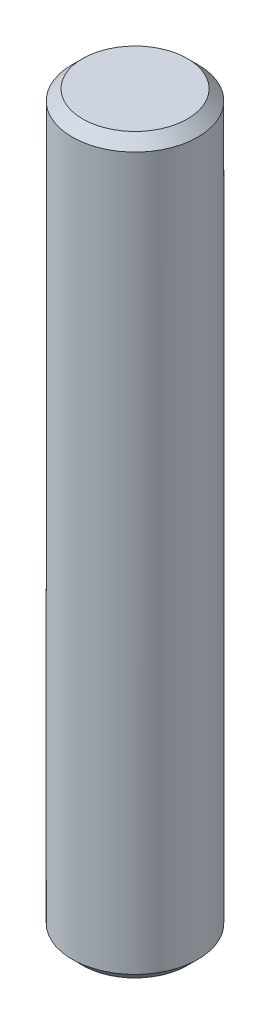
ISO-10303-21;
HEADER;
FILE_DESCRIPTION(('STEP AP214'),'2;1');
FILE_NAME('part.step','',(''),(''),'','','');
FILE_SCHEMA(('AUTOMOTIVE_DESIGN { 1 0 10303 214 1 1 1 1 }'));
ENDSEC;
DATA;
#1=APPLICATION_CONTEXT('core data for automotive mechanical design processes');
#2=APPLICATION_PROTOCOL_DEFINITION('international standard','automotive_design',2000,#1);
#3=PRODUCT_CONTEXT('',#1,'mechanical');
#4=PRODUCT('Part','Part','',(#3));
#5=PRODUCT_RELATED_PRODUCT_CATEGORY('part','',(#4));
#6=PRODUCT_DEFINITION_FORMATION('','',#4);
#7=PRODUCT_DEFINITION_CONTEXT('part definition',#1,'design');
#8=PRODUCT_DEFINITION('design','',#6,#7);
#9=PRODUCT_DEFINITION_SHAPE('','',#8);
#10=(LENGTH_UNIT() NAMED_UNIT(*) SI_UNIT(.MILLI.,.METRE.));
#11=(NAMED_UNIT(*) PLANE_ANGLE_UNIT() SI_UNIT($,.RADIAN.));
#12=(NAMED_UNIT(*) SI_UNIT($,.STERADIAN.) SOLID_ANGLE_UNIT());
#13=UNCERTAINTY_MEASURE_WITH_UNIT(LENGTH_MEASURE(1.E-05),#10,'distance_accuracy_value','');
#14=(GEOMETRIC_REPRESENTATION_CONTEXT(3) GLOBAL_UNCERTAINTY_ASSIGNED_CONTEXT((#13)) GLOBAL_UNIT_ASSIGNED_CONTEXT((#10,
#11,#12)) REPRESENTATION_CONTEXT('',''));
#15=CARTESIAN_POINT('',(0.,0.,0.));
#16=DIRECTION('',(0.,0.,1.));
#17=DIRECTION('',(1.,0.,0.));
#18=AXIS2_PLACEMENT_3D('',#15,#16,#17);
#19=CARTESIAN_POINT('',(0.,70.,0.));
#20=DIRECTION('',(0.,1.,0.));
#21=DIRECTION('',(0.,0.,1.));
#22=AXIS2_PLACEMENT_3D('',#19,#20,#21);
#23=PLANE('',#22);
#24=CARTESIAN_POINT('',(0.,70.,0.));
#25=DIRECTION('',(0.,1.,0.));
#26=DIRECTION('',(0.,0.,1.));
#27=AXIS2_PLACEMENT_3D('',#24,#25,#26);
#28=CIRCLE('',#27,4.99999999999999);
#29=CARTESIAN_POINT('',(0.,70.,4.99999999999999));
#30=VERTEX_POINT('',#29);
#31=EDGE_CURVE('E10',#30,#30,#28,.T.);
#32=ORIENTED_EDGE('',*,*,#31,.T.);
#33=EDGE_LOOP('',(#32));
#34=FACE_BOUND('',#33,.T.);
#35=ADVANCED_FACE('F47',(#34),#23,.T.);
#36=CARTESIAN_POINT('',(0.,0.,0.));
#37=DIRECTION('',(0.,-1.,0.));
#38=DIRECTION('',(0.,0.,-1.));
#39=AXIS2_PLACEMENT_3D('',#36,#37,#38);
#40=CYLINDRICAL_SURFACE('',#39,6.);
#41=CARTESIAN_POINT('',(0.,1.00000000000001,0.));
#42=DIRECTION('',(0.,-1.,0.));
#43=DIRECTION('',(0.,0.,-1.));
#44=AXIS2_PLACEMENT_3D('',#41,#42,#43);
#45=CIRCLE('',#44,6.);
#46=CARTESIAN_POINT('',(0.,1.00000000000001,-6.));
#47=VERTEX_POINT('',#46);
#48=EDGE_CURVE('E55',#47,#47,#45,.F.);
#49=ORIENTED_EDGE('',*,*,#48,.T.);
#50=EDGE_LOOP('',(#49));
#51=FACE_BOUND('',#50,.T.);
#52=CARTESIAN_POINT('',(0.,69.,0.));
#53=DIRECTION('',(0.,1.,0.));
#54=DIRECTION('',(0.,0.,1.));
#55=AXIS2_PLACEMENT_3D('',#52,#53,#54);
#56=CIRCLE('',#55,6.);
#57=CARTESIAN_POINT('',(0.,69.,6.));
#58=VERTEX_POINT('',#57);
#59=EDGE_CURVE('E59',#58,#58,#56,.F.);
#60=ORIENTED_EDGE('',*,*,#59,.T.);
#61=EDGE_LOOP('',(#60));
#62=FACE_BOUND('',#61,.T.);
#63=ADVANCED_FACE('F79',(#51,#62),#40,.T.);
#64=CARTESIAN_POINT('',(0.,0.,0.));
#65=DIRECTION('',(0.,-1.,0.));
#66=DIRECTION('',(0.,0.,-1.));
#67=AXIS2_PLACEMENT_3D('',#64,#65,#66);
#68=PLANE('',#67);
#69=CARTESIAN_POINT('',(0.,0.,0.));
#70=DIRECTION('',(0.,-1.,0.));
#71=DIRECTION('',(0.,0.,-1.));
#72=AXIS2_PLACEMENT_3D('',#69,#70,#71);
#73=CIRCLE('',#72,4.99999999999999);
#74=CARTESIAN_POINT('',(0.,0.,-4.99999999999999));
#75=VERTEX_POINT('',#74);
#76=EDGE_CURVE('E63',#75,#75,#73,.T.);
#77=ORIENTED_EDGE('',*,*,#76,.T.);
#78=EDGE_LOOP('',(#77));
#79=FACE_BOUND('',#78,.T.);
#80=ADVANCED_FACE('F69',(#79),#68,.T.);
#81=CARTESIAN_POINT('',(0.,0.,0.));
#82=DIRECTION('',(0.,1.,0.));
#83=DIRECTION('',(0.,0.,1.));
#84=AXIS2_PLACEMENT_3D('',#81,#82,#83);
#85=CONICAL_SURFACE('',#84,4.99999999999999,0.785398163397448);
#86=ORIENTED_EDGE('',*,*,#48,.F.);
#87=EDGE_LOOP('',(#86));
#88=FACE_BOUND('',#87,.T.);
#89=ORIENTED_EDGE('',*,*,#76,.F.);
#90=EDGE_LOOP('',(#89));
#91=FACE_BOUND('',#90,.T.);
#92=ADVANCED_FACE('F71',(#88,#91),#85,.T.);
#93=CARTESIAN_POINT('',(0.,69.,0.));
#94=DIRECTION('',(0.,-1.,0.));
#95=DIRECTION('',(0.,0.,-1.));
#96=AXIS2_PLACEMENT_3D('',#93,#94,#95);
#97=CONICAL_SURFACE('',#96,6.,0.785398163397446);
#98=ORIENTED_EDGE('',*,*,#31,.F.);
#99=EDGE_LOOP('',(#98));
#100=FACE_BOUND('',#99,.T.);
#101=ORIENTED_EDGE('',*,*,#59,.F.);
#102=EDGE_LOOP('',(#101));
#103=FACE_BOUND('',#102,.T.);
#104=ADVANCED_FACE('F50',(#100,#103),#97,.T.);
#105=CLOSED_SHELL('',(#35,#63,#80,#92,#104));
#106=MANIFOLD_SOLID_BREP('B2',#105);
#107=ADVANCED_BREP_SHAPE_REPRESENTATION('',(#18,#106),#14);
#108=SHAPE_DEFINITION_REPRESENTATION(#9,#107);
ENDSEC;
END-ISO-10303-21;
